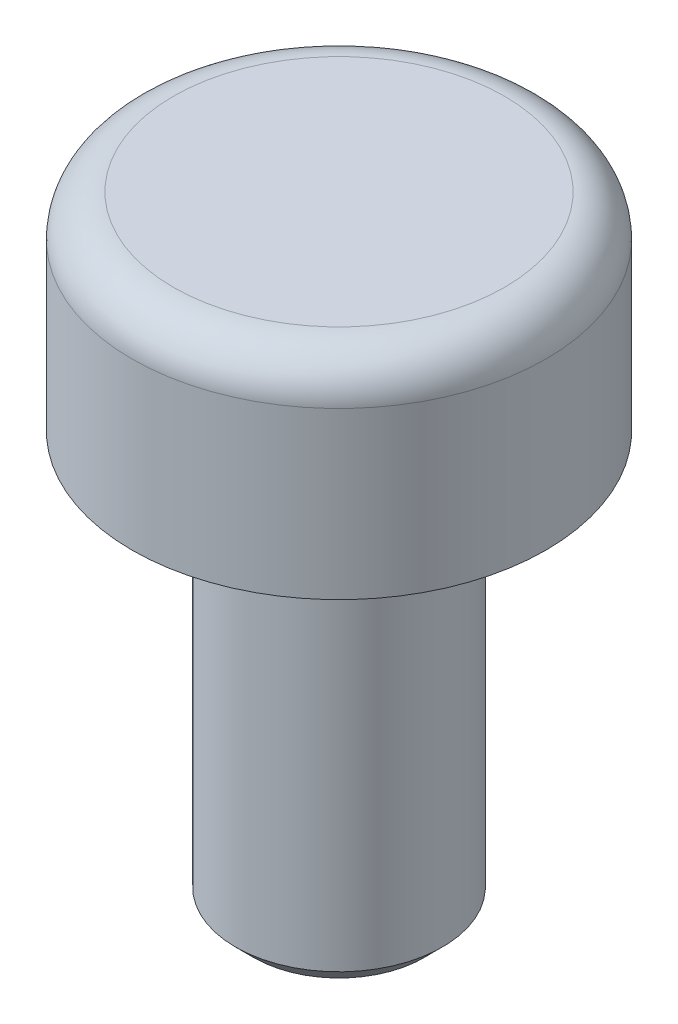
ISO-10303-21;
HEADER;
FILE_DESCRIPTION(('STEP AP214'),'2;1');
FILE_NAME('part.step','',(''),(''),'','','');
FILE_SCHEMA(('AUTOMOTIVE_DESIGN { 1 0 10303 214 1 1 1 1 }'));
ENDSEC;
DATA;
#1=APPLICATION_CONTEXT('core data for automotive mechanical design processes');
#2=APPLICATION_PROTOCOL_DEFINITION('international standard','automotive_design',2000,#1);
#3=PRODUCT_CONTEXT('',#1,'mechanical');
#4=PRODUCT('Part','Part','',(#3));
#5=PRODUCT_RELATED_PRODUCT_CATEGORY('part','',(#4));
#6=PRODUCT_DEFINITION_FORMATION('','',#4);
#7=PRODUCT_DEFINITION_CONTEXT('part definition',#1,'design');
#8=PRODUCT_DEFINITION('design','',#6,#7);
#9=PRODUCT_DEFINITION_SHAPE('','',#8);
#10=(LENGTH_UNIT() NAMED_UNIT(*) SI_UNIT(.MILLI.,.METRE.));
#11=(NAMED_UNIT(*) PLANE_ANGLE_UNIT() SI_UNIT($,.RADIAN.));
#12=(NAMED_UNIT(*) SI_UNIT($,.STERADIAN.) SOLID_ANGLE_UNIT());
#13=UNCERTAINTY_MEASURE_WITH_UNIT(LENGTH_MEASURE(1.E-05),#10,'distance_accuracy_value','');
#14=(GEOMETRIC_REPRESENTATION_CONTEXT(3) GLOBAL_UNCERTAINTY_ASSIGNED_CONTEXT((#13)) GLOBAL_UNIT_ASSIGNED_CONTEXT((#10,
#11,#12)) REPRESENTATION_CONTEXT('',''));
#15=CARTESIAN_POINT('',(0.,0.,0.));
#16=DIRECTION('',(0.,0.,1.));
#17=DIRECTION('',(1.,0.,0.));
#18=AXIS2_PLACEMENT_3D('',#15,#16,#17);
#19=CARTESIAN_POINT('',(0.,15.,0.));
#20=DIRECTION('',(0.,-1.,0.));
#21=DIRECTION('',(0.,0.,-1.));
#22=AXIS2_PLACEMENT_3D('',#19,#20,#21);
#23=CYLINDRICAL_SURFACE('',#22,5.);
#24=CARTESIAN_POINT('',(0.,14.,0.));
#25=DIRECTION('',(0.,1.,0.));
#26=DIRECTION('',(0.,0.,1.));
#27=AXIS2_PLACEMENT_3D('',#24,#25,#26);
#28=CIRCLE('',#27,5.);
#29=CARTESIAN_POINT('',(0.,14.,5.));
#30=VERTEX_POINT('',#29);
#31=EDGE_CURVE('E10',#30,#30,#28,.F.);
#32=ORIENTED_EDGE('',*,*,#31,.T.);
#33=EDGE_LOOP('',(#32));
#34=FACE_BOUND('',#33,.T.);
#35=CARTESIAN_POINT('',(0.,10.,0.));
#36=DIRECTION('',(0.,1.,0.));
#37=DIRECTION('',(0.,0.,1.));
#38=AXIS2_PLACEMENT_3D('',#35,#36,#37);
#39=CIRCLE('',#38,5.);
#40=CARTESIAN_POINT('',(0.,10.,5.));
#41=VERTEX_POINT('',#40);
#42=EDGE_CURVE('E59',#41,#41,#39,.T.);
#43=ORIENTED_EDGE('',*,*,#42,.T.);
#44=EDGE_LOOP('',(#43));
#45=FACE_BOUND('',#44,.T.);
#46=ADVANCED_FACE('F45',(#34,#45),#23,.T.);
#47=CARTESIAN_POINT('',(0.,15.,0.));
#48=DIRECTION('',(0.,1.,0.));
#49=DIRECTION('',(0.,0.,1.));
#50=AXIS2_PLACEMENT_3D('',#47,#48,#49);
#51=PLANE('',#50);
#52=CARTESIAN_POINT('',(0.,15.,0.));
#53=DIRECTION('',(0.,1.,0.));
#54=DIRECTION('',(0.,0.,1.));
#55=AXIS2_PLACEMENT_3D('',#52,#53,#54);
#56=CIRCLE('',#55,4.);
#57=CARTESIAN_POINT('',(0.,15.,4.));
#58=VERTEX_POINT('',#57);
#59=EDGE_CURVE('E53',#58,#58,#56,.T.);
#60=ORIENTED_EDGE('',*,*,#59,.T.);
#61=EDGE_LOOP('',(#60));
#62=FACE_BOUND('',#61,.T.);
#63=ADVANCED_FACE('F95',(#62),#51,.T.);
#64=CARTESIAN_POINT('',(0.,10.,0.));
#65=DIRECTION('',(0.,1.,0.));
#66=DIRECTION('',(0.,0.,1.));
#67=AXIS2_PLACEMENT_3D('',#64,#65,#66);
#68=PLANE('',#67);
#69=ORIENTED_EDGE('',*,*,#42,.F.);
#70=EDGE_LOOP('',(#69));
#71=FACE_BOUND('',#70,.T.);
#72=CARTESIAN_POINT('',(0.,10.,0.));
#73=DIRECTION('',(0.,1.,0.));
#74=DIRECTION('',(0.,0.,1.));
#75=AXIS2_PLACEMENT_3D('',#72,#73,#74);
#76=CIRCLE('',#75,2.5);
#77=CARTESIAN_POINT('',(0.,10.,2.5));
#78=VERTEX_POINT('',#77);
#79=EDGE_CURVE('E65',#78,#78,#76,.T.);
#80=ORIENTED_EDGE('',*,*,#79,.T.);
#81=EDGE_LOOP('',(#80));
#82=FACE_BOUND('',#81,.T.);
#83=ADVANCED_FACE('F99',(#71,#82),#68,.F.);
#84=CARTESIAN_POINT('',(0.,14.,0.));
#85=DIRECTION('',(0.,1.,0.));
#86=DIRECTION('',(0.,0.,1.));
#87=AXIS2_PLACEMENT_3D('',#84,#85,#86);
#88=TOROIDAL_SURFACE('',#87,4.,1.);
#89=ORIENTED_EDGE('',*,*,#31,.F.);
#90=EDGE_LOOP('',(#89));
#91=FACE_BOUND('',#90,.T.);
#92=ORIENTED_EDGE('',*,*,#59,.F.);
#93=EDGE_LOOP('',(#92));
#94=FACE_BOUND('',#93,.T.);
#95=ADVANCED_FACE('F47',(#91,#94),#88,.T.);
#96=CARTESIAN_POINT('',(0.,0.,0.));
#97=DIRECTION('',(0.,1.,0.));
#98=DIRECTION('',(0.,0.,1.));
#99=AXIS2_PLACEMENT_3D('',#96,#97,#98);
#100=CYLINDRICAL_SURFACE('',#99,2.5);
#101=ORIENTED_EDGE('',*,*,#79,.F.);
#102=EDGE_LOOP('',(#101));
#103=FACE_BOUND('',#102,.T.);
#104=CARTESIAN_POINT('',(0.,0.444999999999991,0.));
#105=DIRECTION('',(0.,1.,0.));
#106=DIRECTION('',(0.,0.,1.));
#107=AXIS2_PLACEMENT_3D('',#104,#105,#106);
#108=CIRCLE('',#107,2.5);
#109=CARTESIAN_POINT('',(0.,0.444999999999991,2.5));
#110=VERTEX_POINT('',#109);
#111=EDGE_CURVE('E75',#110,#110,#108,.T.);
#112=ORIENTED_EDGE('',*,*,#111,.T.);
#113=EDGE_LOOP('',(#112));
#114=FACE_BOUND('',#113,.T.);
#115=ADVANCED_FACE('F81',(#103,#114),#100,.T.);
#116=CARTESIAN_POINT('',(0.,0.,0.));
#117=DIRECTION('',(0.,1.,0.));
#118=DIRECTION('',(0.,0.,1.));
#119=AXIS2_PLACEMENT_3D('',#116,#117,#118);
#120=CONICAL_SURFACE('',#119,2.055,0.785398163397456);
#121=ORIENTED_EDGE('',*,*,#111,.F.);
#122=EDGE_LOOP('',(#121));
#123=FACE_BOUND('',#122,.T.);
#124=CARTESIAN_POINT('',(0.,0.,0.));
#125=DIRECTION('',(0.,1.,0.));
#126=DIRECTION('',(0.,0.,1.));
#127=AXIS2_PLACEMENT_3D('',#124,#125,#126);
#128=CIRCLE('',#127,2.055);
#129=CARTESIAN_POINT('',(0.,0.,2.055));
#130=VERTEX_POINT('',#129);
#131=EDGE_CURVE('E71',#130,#130,#128,.T.);
#132=ORIENTED_EDGE('',*,*,#131,.T.);
#133=EDGE_LOOP('',(#132));
#134=FACE_BOUND('',#133,.T.);
#135=ADVANCED_FACE('F83',(#123,#134),#120,.T.);
#136=CARTESIAN_POINT('',(0.,0.,0.));
#137=DIRECTION('',(0.,1.,0.));
#138=DIRECTION('',(0.,0.,1.));
#139=AXIS2_PLACEMENT_3D('',#136,#137,#138);
#140=PLANE('',#139);
#141=ORIENTED_EDGE('',*,*,#131,.F.);
#142=EDGE_LOOP('',(#141));
#143=FACE_BOUND('',#142,.T.);
#144=ADVANCED_FACE('F86',(#143),#140,.F.);
#145=CLOSED_SHELL('',(#46,#63,#83,#95,#115,#135,#144));
#146=MANIFOLD_SOLID_BREP('B2',#145);
#147=ADVANCED_BREP_SHAPE_REPRESENTATION('',(#18,#146),#14);
#148=SHAPE_DEFINITION_REPRESENTATION(#9,#147);
ENDSEC;
END-ISO-10303-21;
